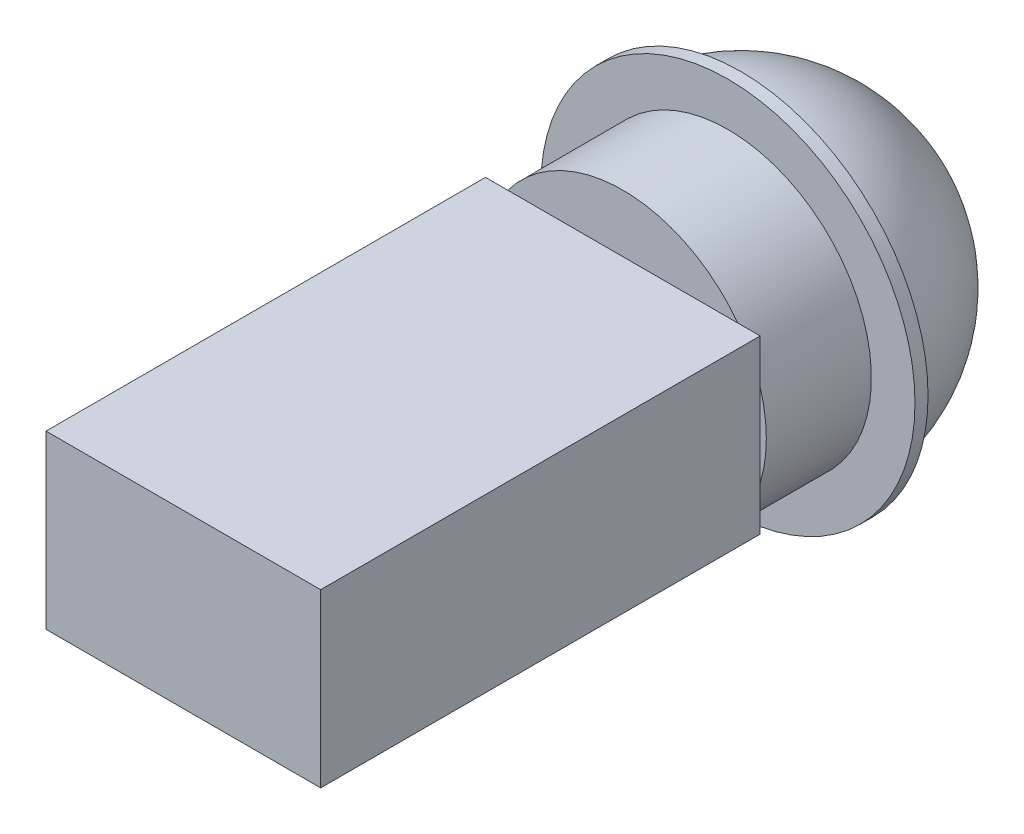
ISO-10303-21;
HEADER;
FILE_DESCRIPTION(('STEP AP214'),'2;1');
FILE_NAME('part.step','',(''),(''),'','','');
FILE_SCHEMA(('AUTOMOTIVE_DESIGN { 1 0 10303 214 1 1 1 1 }'));
ENDSEC;
DATA;
#1=APPLICATION_CONTEXT('core data for automotive mechanical design processes');
#2=APPLICATION_PROTOCOL_DEFINITION('international standard','automotive_design',2000,#1);
#3=PRODUCT_CONTEXT('',#1,'mechanical');
#4=PRODUCT('Part','Part','',(#3));
#5=PRODUCT_RELATED_PRODUCT_CATEGORY('part','',(#4));
#6=PRODUCT_DEFINITION_FORMATION('','',#4);
#7=PRODUCT_DEFINITION_CONTEXT('part definition',#1,'design');
#8=PRODUCT_DEFINITION('design','',#6,#7);
#9=PRODUCT_DEFINITION_SHAPE('','',#8);
#10=(LENGTH_UNIT() NAMED_UNIT(*) SI_UNIT(.MILLI.,.METRE.));
#11=(NAMED_UNIT(*) PLANE_ANGLE_UNIT() SI_UNIT($,.RADIAN.));
#12=(NAMED_UNIT(*) SI_UNIT($,.STERADIAN.) SOLID_ANGLE_UNIT());
#13=UNCERTAINTY_MEASURE_WITH_UNIT(LENGTH_MEASURE(1.E-05),#10,'distance_accuracy_value','');
#14=(GEOMETRIC_REPRESENTATION_CONTEXT(3) GLOBAL_UNCERTAINTY_ASSIGNED_CONTEXT((#13)) GLOBAL_UNIT_ASSIGNED_CONTEXT((#10,
#11,#12)) REPRESENTATION_CONTEXT('',''));
#15=CARTESIAN_POINT('',(0.,0.,0.));
#16=DIRECTION('',(0.,0.,1.));
#17=DIRECTION('',(1.,0.,0.));
#18=AXIS2_PLACEMENT_3D('',#15,#16,#17);
#19=CARTESIAN_POINT('',(0.,0.,4.3688));
#20=DIRECTION('',(0.,0.,1.));
#21=DIRECTION('',(1.,0.,0.));
#22=AXIS2_PLACEMENT_3D('',#19,#20,#21);
#23=PLANE('',#22);
#24=DIRECTION('',(0.,-1.,0.));
#25=VECTOR('',#24,1.);
#26=CARTESIAN_POINT('',(-5.08,3.175,4.3688));
#27=LINE('',#26,#25);
#28=CARTESIAN_POINT('',(-5.08,1.54104962931113,4.3688));
#29=VERTEX_POINT('',#28);
#30=CARTESIAN_POINT('',(-5.08,-1.54104962931113,4.3688));
#31=VERTEX_POINT('',#30);
#32=EDGE_CURVE('E11',#29,#31,#27,.T.);
#33=ORIENTED_EDGE('',*,*,#32,.F.);
#34=CARTESIAN_POINT('',(0.,0.,4.3688));
#35=DIRECTION('',(0.,0.,-1.));
#36=DIRECTION('',(-1.,0.,0.));
#37=AXIS2_PLACEMENT_3D('',#34,#35,#36);
#38=CIRCLE('',#37,5.3086);
#39=EDGE_CURVE('E58',#31,#29,#38,.T.);
#40=ORIENTED_EDGE('',*,*,#39,.F.);
#41=EDGE_LOOP('',(#33,#40));
#42=FACE_BOUND('',#41,.T.);
#43=ADVANCED_FACE('F39',(#42),#23,.T.);
#44=DIRECTION('',(-1.,0.,0.));
#45=VECTOR('',#44,1.);
#46=CARTESIAN_POINT('',(5.08,3.175,4.3688));
#47=LINE('',#46,#45);
#48=CARTESIAN_POINT('',(4.25448104473389,3.175,4.3688));
#49=VERTEX_POINT('',#48);
#50=CARTESIAN_POINT('',(-4.25448104473389,3.175,4.3688));
#51=VERTEX_POINT('',#50);
#52=EDGE_CURVE('E49',#49,#51,#47,.T.);
#53=ORIENTED_EDGE('',*,*,#52,.F.);
#54=EDGE_CURVE('E169',#51,#49,#38,.T.);
#55=ORIENTED_EDGE('',*,*,#54,.F.);
#56=EDGE_LOOP('',(#53,#55));
#57=FACE_BOUND('',#56,.T.);
#58=ADVANCED_FACE('F249',(#57),#23,.T.);
#59=DIRECTION('',(0.,1.,0.));
#60=VECTOR('',#59,1.);
#61=CARTESIAN_POINT('',(5.08,3.175,4.3688));
#62=LINE('',#61,#60);
#63=CARTESIAN_POINT('',(5.08,-1.54104962931114,4.3688));
#64=VERTEX_POINT('',#63);
#65=CARTESIAN_POINT('',(5.08,1.54104962931114,4.3688));
#66=VERTEX_POINT('',#65);
#67=EDGE_CURVE('E174',#64,#66,#62,.T.);
#68=ORIENTED_EDGE('',*,*,#67,.F.);
#69=EDGE_CURVE('E182',#66,#64,#38,.T.);
#70=ORIENTED_EDGE('',*,*,#69,.F.);
#71=EDGE_LOOP('',(#68,#70));
#72=FACE_BOUND('',#71,.T.);
#73=ADVANCED_FACE('F254',(#72),#23,.T.);
#74=CARTESIAN_POINT('',(0.,0.,0.));
#75=DIRECTION('',(0.,0.,-1.));
#76=DIRECTION('',(1.,0.,0.));
#77=AXIS2_PLACEMENT_3D('',#74,#75,#76);
#78=SPHERICAL_SURFACE('',#77,6.20395);
#79=CARTESIAN_POINT('',(0.,0.,0.));
#80=DIRECTION('',(0.,0.,-1.));
#81=DIRECTION('',(-1.,0.,0.));
#82=AXIS2_PLACEMENT_3D('',#79,#80,#81);
#83=CIRCLE('',#82,6.20395);
#84=CARTESIAN_POINT('',(-6.20395,0.,0.));
#85=VERTEX_POINT('',#84);
#86=EDGE_CURVE('E139',#85,#85,#83,.T.);
#87=ORIENTED_EDGE('',*,*,#86,.T.);
#88=EDGE_LOOP('',(#87));
#89=FACE_BOUND('',#88,.T.);
#90=ADVANCED_FACE('F41',(#89),#78,.T.);
#91=DIRECTION('',(1.,0.,0.));
#92=VECTOR('',#91,1.);
#93=CARTESIAN_POINT('',(5.08,-3.175,4.3688));
#94=LINE('',#93,#92);
#95=CARTESIAN_POINT('',(-4.25448104473389,-3.175,4.3688));
#96=VERTEX_POINT('',#95);
#97=CARTESIAN_POINT('',(4.25448104473389,-3.175,4.3688));
#98=VERTEX_POINT('',#97);
#99=EDGE_CURVE('E65',#96,#98,#94,.T.);
#100=ORIENTED_EDGE('',*,*,#99,.F.);
#101=EDGE_CURVE('E167',#98,#96,#38,.T.);
#102=ORIENTED_EDGE('',*,*,#101,.F.);
#103=EDGE_LOOP('',(#100,#102));
#104=FACE_BOUND('',#103,.T.);
#105=ADVANCED_FACE('F250',(#104),#23,.T.);
#106=CARTESIAN_POINT('',(0.,0.,-6.20395));
#107=DIRECTION('',(0.,0.,-1.));
#108=DIRECTION('',(-1.,0.,0.));
#109=AXIS2_PLACEMENT_3D('',#106,#107,#108);
#110=CYLINDRICAL_SURFACE('',#109,5.3086);
#111=EDGE_CURVE('E43',#29,#51,#38,.T.);
#112=ORIENTED_EDGE('',*,*,#111,.T.);
#113=ORIENTED_EDGE('',*,*,#54,.T.);
#114=EDGE_CURVE('E178',#49,#66,#38,.T.);
#115=ORIENTED_EDGE('',*,*,#114,.T.);
#116=ORIENTED_EDGE('',*,*,#69,.T.);
#117=EDGE_CURVE('E186',#64,#98,#38,.T.);
#118=ORIENTED_EDGE('',*,*,#117,.T.);
#119=ORIENTED_EDGE('',*,*,#101,.T.);
#120=EDGE_CURVE('E162',#96,#31,#38,.T.);
#121=ORIENTED_EDGE('',*,*,#120,.T.);
#122=ORIENTED_EDGE('',*,*,#39,.T.);
#123=EDGE_LOOP('',(#112,#113,#115,#116,#118,#119,#121,#122));
#124=FACE_BOUND('',#123,.T.);
#125=CARTESIAN_POINT('',(0.,0.,0.482599999999999));
#126=DIRECTION('',(0.,0.,-1.));
#127=DIRECTION('',(-1.,0.,0.));
#128=AXIS2_PLACEMENT_3D('',#125,#126,#127);
#129=CIRCLE('',#128,5.3086);
#130=CARTESIAN_POINT('',(-5.3086,0.,0.482599999999999));
#131=VERTEX_POINT('',#130);
#132=EDGE_CURVE('E156',#131,#131,#129,.T.);
#133=ORIENTED_EDGE('',*,*,#132,.F.);
#134=EDGE_LOOP('',(#133));
#135=FACE_BOUND('',#134,.T.);
#136=ADVANCED_FACE('F191',(#124,#135),#110,.T.);
#137=CARTESIAN_POINT('',(-5.3086,0.,0.4826));
#138=DIRECTION('',(0.,0.,1.));
#139=DIRECTION('',(1.,0.,0.));
#140=AXIS2_PLACEMENT_3D('',#137,#138,#139);
#141=PLANE('',#140);
#142=ORIENTED_EDGE('',*,*,#132,.T.);
#143=EDGE_LOOP('',(#142));
#144=FACE_BOUND('',#143,.T.);
#145=CARTESIAN_POINT('',(0.,0.,0.4826));
#146=DIRECTION('',(0.,0.,-1.));
#147=DIRECTION('',(-1.,0.,0.));
#148=AXIS2_PLACEMENT_3D('',#145,#146,#147);
#149=CIRCLE('',#148,6.9215);
#150=CARTESIAN_POINT('',(-6.9215,0.,0.4826));
#151=VERTEX_POINT('',#150);
#152=EDGE_CURVE('E153',#151,#151,#149,.T.);
#153=ORIENTED_EDGE('',*,*,#152,.F.);
#154=EDGE_LOOP('',(#153));
#155=FACE_BOUND('',#154,.T.);
#156=ADVANCED_FACE('F262',(#144,#155),#141,.T.);
#157=CARTESIAN_POINT('',(0.,0.,-6.20395));
#158=DIRECTION('',(0.,0.,-1.));
#159=DIRECTION('',(-1.,0.,0.));
#160=AXIS2_PLACEMENT_3D('',#157,#158,#159);
#161=CYLINDRICAL_SURFACE('',#160,6.9215);
#162=ORIENTED_EDGE('',*,*,#152,.T.);
#163=EDGE_LOOP('',(#162));
#164=FACE_BOUND('',#163,.T.);
#165=CARTESIAN_POINT('',(0.,0.,0.));
#166=DIRECTION('',(0.,0.,-1.));
#167=DIRECTION('',(-1.,0.,0.));
#168=AXIS2_PLACEMENT_3D('',#165,#166,#167);
#169=CIRCLE('',#168,6.9215);
#170=CARTESIAN_POINT('',(-6.9215,0.,0.));
#171=VERTEX_POINT('',#170);
#172=EDGE_CURVE('E144',#171,#171,#169,.T.);
#173=ORIENTED_EDGE('',*,*,#172,.F.);
#174=EDGE_LOOP('',(#173));
#175=FACE_BOUND('',#174,.T.);
#176=ADVANCED_FACE('F242',(#164,#175),#161,.T.);
#177=CARTESIAN_POINT('',(-6.9215,0.,0.));
#178=DIRECTION('',(0.,0.,-1.));
#179=DIRECTION('',(-1.,0.,0.));
#180=AXIS2_PLACEMENT_3D('',#177,#178,#179);
#181=PLANE('',#180);
#182=ORIENTED_EDGE('',*,*,#172,.T.);
#183=EDGE_LOOP('',(#182));
#184=FACE_BOUND('',#183,.T.);
#185=ORIENTED_EDGE('',*,*,#86,.F.);
#186=EDGE_LOOP('',(#185));
#187=FACE_BOUND('',#186,.T.);
#188=ADVANCED_FACE('F235',(#184,#187),#181,.T.);
#189=CARTESIAN_POINT('',(0.,0.,4.3688));
#190=DIRECTION('',(0.,0.,-1.));
#191=DIRECTION('',(-1.,0.,0.));
#192=AXIS2_PLACEMENT_3D('',#189,#190,#191);
#193=PLANE('',#192);
#194=ORIENTED_EDGE('',*,*,#111,.F.);
#195=CARTESIAN_POINT('',(-5.08,3.175,4.3688));
#196=VERTEX_POINT('',#195);
#197=EDGE_CURVE('E51',#196,#29,#27,.T.);
#198=ORIENTED_EDGE('',*,*,#197,.F.);
#199=EDGE_CURVE('E206',#51,#196,#47,.T.);
#200=ORIENTED_EDGE('',*,*,#199,.F.);
#201=EDGE_LOOP('',(#194,#198,#200));
#202=FACE_BOUND('',#201,.T.);
#203=ADVANCED_FACE('F231',(#202),#193,.T.);
#204=ORIENTED_EDGE('',*,*,#114,.F.);
#205=CARTESIAN_POINT('',(5.08,3.175,4.3688));
#206=VERTEX_POINT('',#205);
#207=EDGE_CURVE('E132',#206,#49,#47,.T.);
#208=ORIENTED_EDGE('',*,*,#207,.F.);
#209=EDGE_CURVE('E197',#66,#206,#62,.T.);
#210=ORIENTED_EDGE('',*,*,#209,.F.);
#211=EDGE_LOOP('',(#204,#208,#210));
#212=FACE_BOUND('',#211,.T.);
#213=ADVANCED_FACE('F221',(#212),#193,.T.);
#214=ORIENTED_EDGE('',*,*,#117,.F.);
#215=CARTESIAN_POINT('',(5.08,-3.175,4.3688));
#216=VERTEX_POINT('',#215);
#217=EDGE_CURVE('E200',#216,#64,#62,.T.);
#218=ORIENTED_EDGE('',*,*,#217,.F.);
#219=EDGE_CURVE('E177',#98,#216,#94,.T.);
#220=ORIENTED_EDGE('',*,*,#219,.F.);
#221=EDGE_LOOP('',(#214,#218,#220));
#222=FACE_BOUND('',#221,.T.);
#223=ADVANCED_FACE('F241',(#222),#193,.T.);
#224=ORIENTED_EDGE('',*,*,#120,.F.);
#225=CARTESIAN_POINT('',(-5.08,-3.175,4.3688));
#226=VERTEX_POINT('',#225);
#227=EDGE_CURVE('E176',#226,#96,#94,.T.);
#228=ORIENTED_EDGE('',*,*,#227,.F.);
#229=EDGE_CURVE('E52',#31,#226,#27,.T.);
#230=ORIENTED_EDGE('',*,*,#229,.F.);
#231=EDGE_LOOP('',(#224,#228,#230));
#232=FACE_BOUND('',#231,.T.);
#233=ADVANCED_FACE('F195',(#232),#193,.T.);
#234=CARTESIAN_POINT('',(-5.08,3.175,20.6248));
#235=DIRECTION('',(1.,0.,0.));
#236=DIRECTION('',(0.,1.,0.));
#237=AXIS2_PLACEMENT_3D('',#234,#235,#236);
#238=PLANE('',#237);
#239=ORIENTED_EDGE('',*,*,#197,.T.);
#240=ORIENTED_EDGE('',*,*,#32,.T.);
#241=ORIENTED_EDGE('',*,*,#229,.T.);
#242=DIRECTION('',(0.,0.,-1.));
#243=VECTOR('',#242,1.);
#244=CARTESIAN_POINT('',(-5.08,-3.175,20.6248));
#245=LINE('',#244,#243);
#246=CARTESIAN_POINT('',(-5.08,-3.175,20.6248));
#247=VERTEX_POINT('',#246);
#248=EDGE_CURVE('E115',#247,#226,#245,.T.);
#249=ORIENTED_EDGE('',*,*,#248,.F.);
#250=DIRECTION('',(0.,-1.,0.));
#251=VECTOR('',#250,1.);
#252=CARTESIAN_POINT('',(-5.08,3.175,20.6248));
#253=LINE('',#252,#251);
#254=CARTESIAN_POINT('',(-5.08,3.175,20.6248));
#255=VERTEX_POINT('',#254);
#256=EDGE_CURVE('E122',#255,#247,#253,.T.);
#257=ORIENTED_EDGE('',*,*,#256,.F.);
#258=DIRECTION('',(0.,0.,-1.));
#259=VECTOR('',#258,1.);
#260=CARTESIAN_POINT('',(-5.08,3.175,20.6248));
#261=LINE('',#260,#259);
#262=EDGE_CURVE('E210',#255,#196,#261,.T.);
#263=ORIENTED_EDGE('',*,*,#262,.T.);
#264=EDGE_LOOP('',(#239,#240,#241,#249,#257,#263));
#265=FACE_BOUND('',#264,.T.);
#266=ADVANCED_FACE('F135',(#265),#238,.F.);
#267=CARTESIAN_POINT('',(5.08,-3.175,20.6248));
#268=DIRECTION('',(0.,1.,0.));
#269=DIRECTION('',(-1.,0.,0.));
#270=AXIS2_PLACEMENT_3D('',#267,#268,#269);
#271=PLANE('',#270);
#272=ORIENTED_EDGE('',*,*,#227,.T.);
#273=ORIENTED_EDGE('',*,*,#99,.T.);
#274=ORIENTED_EDGE('',*,*,#219,.T.);
#275=DIRECTION('',(0.,0.,-1.));
#276=VECTOR('',#275,1.);
#277=CARTESIAN_POINT('',(5.08,-3.175,20.6248));
#278=LINE('',#277,#276);
#279=CARTESIAN_POINT('',(5.08,-3.175,20.6248));
#280=VERTEX_POINT('',#279);
#281=EDGE_CURVE('E117',#280,#216,#278,.T.);
#282=ORIENTED_EDGE('',*,*,#281,.F.);
#283=DIRECTION('',(1.,0.,0.));
#284=VECTOR('',#283,1.);
#285=CARTESIAN_POINT('',(5.08,-3.175,20.6248));
#286=LINE('',#285,#284);
#287=EDGE_CURVE('E110',#247,#280,#286,.T.);
#288=ORIENTED_EDGE('',*,*,#287,.F.);
#289=ORIENTED_EDGE('',*,*,#248,.T.);
#290=EDGE_LOOP('',(#272,#273,#274,#282,#288,#289));
#291=FACE_BOUND('',#290,.T.);
#292=ADVANCED_FACE('F113',(#291),#271,.F.);
#293=CARTESIAN_POINT('',(5.08,3.175,20.6248));
#294=DIRECTION('',(-1.,0.,0.));
#295=DIRECTION('',(0.,0.,1.));
#296=AXIS2_PLACEMENT_3D('',#293,#294,#295);
#297=PLANE('',#296);
#298=ORIENTED_EDGE('',*,*,#217,.T.);
#299=ORIENTED_EDGE('',*,*,#67,.T.);
#300=ORIENTED_EDGE('',*,*,#209,.T.);
#301=DIRECTION('',(0.,0.,-1.));
#302=VECTOR('',#301,1.);
#303=CARTESIAN_POINT('',(5.08,3.175,20.6248));
#304=LINE('',#303,#302);
#305=CARTESIAN_POINT('',(5.08,3.175,20.6248));
#306=VERTEX_POINT('',#305);
#307=EDGE_CURVE('E146',#306,#206,#304,.T.);
#308=ORIENTED_EDGE('',*,*,#307,.F.);
#309=DIRECTION('',(0.,1.,0.));
#310=VECTOR('',#309,1.);
#311=CARTESIAN_POINT('',(5.08,3.175,20.6248));
#312=LINE('',#311,#310);
#313=EDGE_CURVE('E121',#280,#306,#312,.T.);
#314=ORIENTED_EDGE('',*,*,#313,.F.);
#315=ORIENTED_EDGE('',*,*,#281,.T.);
#316=EDGE_LOOP('',(#298,#299,#300,#308,#314,#315));
#317=FACE_BOUND('',#316,.T.);
#318=ADVANCED_FACE('F223',(#317),#297,.F.);
#319=CARTESIAN_POINT('',(5.08,3.175,20.6248));
#320=DIRECTION('',(0.,-1.,0.));
#321=DIRECTION('',(1.,0.,0.));
#322=AXIS2_PLACEMENT_3D('',#319,#320,#321);
#323=PLANE('',#322);
#324=ORIENTED_EDGE('',*,*,#207,.T.);
#325=ORIENTED_EDGE('',*,*,#52,.T.);
#326=ORIENTED_EDGE('',*,*,#199,.T.);
#327=ORIENTED_EDGE('',*,*,#262,.F.);
#328=DIRECTION('',(-1.,0.,0.));
#329=VECTOR('',#328,1.);
#330=CARTESIAN_POINT('',(5.08,3.175,20.6248));
#331=LINE('',#330,#329);
#332=EDGE_CURVE('E127',#306,#255,#331,.T.);
#333=ORIENTED_EDGE('',*,*,#332,.F.);
#334=ORIENTED_EDGE('',*,*,#307,.T.);
#335=EDGE_LOOP('',(#324,#325,#326,#327,#333,#334));
#336=FACE_BOUND('',#335,.T.);
#337=ADVANCED_FACE('F217',(#336),#323,.F.);
#338=CARTESIAN_POINT('',(0.,0.,20.6248));
#339=DIRECTION('',(0.,0.,-1.));
#340=DIRECTION('',(-1.,0.,0.));
#341=AXIS2_PLACEMENT_3D('',#338,#339,#340);
#342=PLANE('',#341);
#343=ORIENTED_EDGE('',*,*,#256,.T.);
#344=ORIENTED_EDGE('',*,*,#287,.T.);
#345=ORIENTED_EDGE('',*,*,#313,.T.);
#346=ORIENTED_EDGE('',*,*,#332,.T.);
#347=EDGE_LOOP('',(#343,#344,#345,#346));
#348=FACE_BOUND('',#347,.T.);
#349=ADVANCED_FACE('F125',(#348),#342,.F.);
#350=CLOSED_SHELL('',(#43,#58,#73,#90,#105,#136,#156,#176,#188,#203,#213,#223,#233,#266,#292,
#318,#337,#349));
#351=MANIFOLD_SOLID_BREP('B2',#350);
#352=ADVANCED_BREP_SHAPE_REPRESENTATION('',(#18,#351),#14);
#353=SHAPE_DEFINITION_REPRESENTATION(#9,#352);
ENDSEC;
END-ISO-10303-21;
